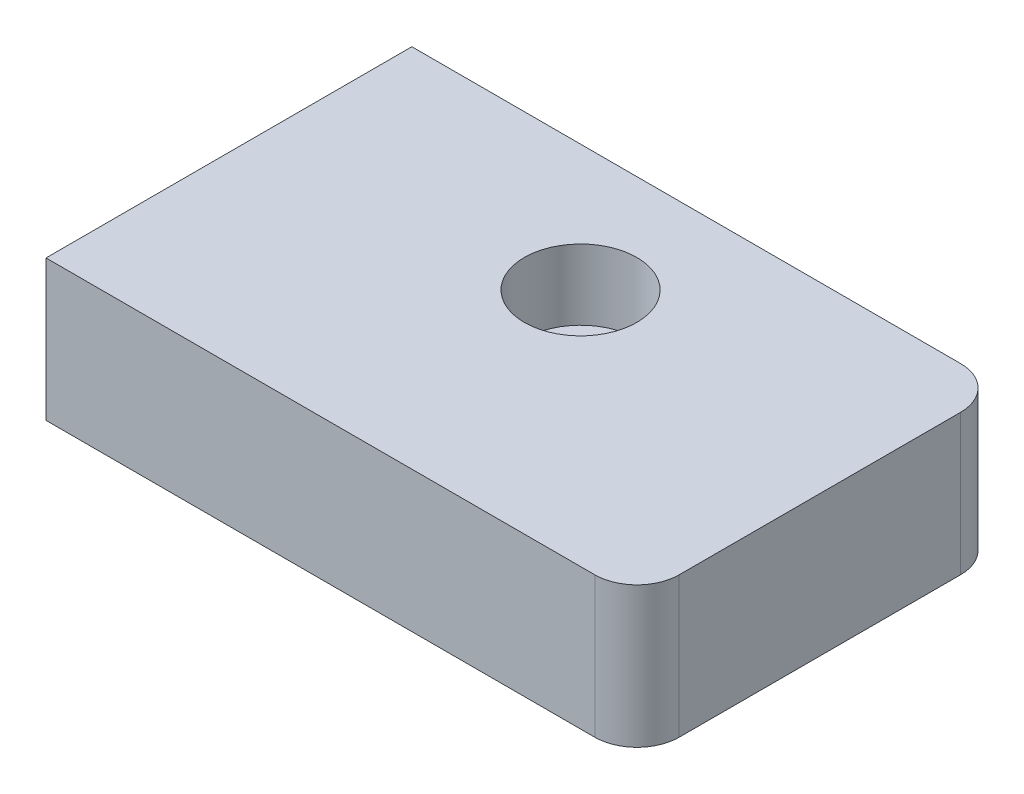
ISO-10303-21;
HEADER;
FILE_DESCRIPTION(('STEP AP214'),'2;1');
FILE_NAME('part.step','',(''),(''),'','','');
FILE_SCHEMA(('AUTOMOTIVE_DESIGN { 1 0 10303 214 1 1 1 1 }'));
ENDSEC;
DATA;
#1=APPLICATION_CONTEXT('core data for automotive mechanical design processes');
#2=APPLICATION_PROTOCOL_DEFINITION('international standard','automotive_design',2000,#1);
#3=PRODUCT_CONTEXT('',#1,'mechanical');
#4=PRODUCT('Part','Part','',(#3));
#5=PRODUCT_RELATED_PRODUCT_CATEGORY('part','',(#4));
#6=PRODUCT_DEFINITION_FORMATION('','',#4);
#7=PRODUCT_DEFINITION_CONTEXT('part definition',#1,'design');
#8=PRODUCT_DEFINITION('design','',#6,#7);
#9=PRODUCT_DEFINITION_SHAPE('','',#8);
#10=(LENGTH_UNIT() NAMED_UNIT(*) SI_UNIT(.MILLI.,.METRE.));
#11=(NAMED_UNIT(*) PLANE_ANGLE_UNIT() SI_UNIT($,.RADIAN.));
#12=(NAMED_UNIT(*) SI_UNIT($,.STERADIAN.) SOLID_ANGLE_UNIT());
#13=UNCERTAINTY_MEASURE_WITH_UNIT(LENGTH_MEASURE(1.E-05),#10,'distance_accuracy_value','');
#14=(GEOMETRIC_REPRESENTATION_CONTEXT(3) GLOBAL_UNCERTAINTY_ASSIGNED_CONTEXT((#13)) GLOBAL_UNIT_ASSIGNED_CONTEXT((#10,
#11,#12)) REPRESENTATION_CONTEXT('',''));
#15=CARTESIAN_POINT('',(0.,0.,0.));
#16=DIRECTION('',(0.,0.,1.));
#17=DIRECTION('',(1.,0.,0.));
#18=AXIS2_PLACEMENT_3D('',#15,#16,#17);
#19=CARTESIAN_POINT('',(21.,10.,-13.));
#20=DIRECTION('',(-1.,0.,0.));
#21=DIRECTION('',(0.,0.,1.));
#22=AXIS2_PLACEMENT_3D('',#19,#20,#21);
#23=PLANE('',#22);
#24=DIRECTION('',(0.,0.,-1.));
#25=VECTOR('',#24,1.);
#26=CARTESIAN_POINT('',(21.,0.,-13.));
#27=LINE('',#26,#25);
#28=CARTESIAN_POINT('',(21.,0.,9.99999999999999));
#29=VERTEX_POINT('',#28);
#30=CARTESIAN_POINT('',(21.,0.,-10.));
#31=VERTEX_POINT('',#30);
#32=EDGE_CURVE('E118',#29,#31,#27,.T.);
#33=ORIENTED_EDGE('',*,*,#32,.T.);
#34=DIRECTION('',(0.,-1.,0.));
#35=VECTOR('',#34,1.);
#36=CARTESIAN_POINT('',(21.,10.,-10.));
#37=LINE('',#36,#35);
#38=CARTESIAN_POINT('',(21.,10.,-10.));
#39=VERTEX_POINT('',#38);
#40=EDGE_CURVE('E56',#31,#39,#37,.F.);
#41=ORIENTED_EDGE('',*,*,#40,.T.);
#42=DIRECTION('',(0.,0.,-1.));
#43=VECTOR('',#42,1.);
#44=CARTESIAN_POINT('',(21.,10.,-13.));
#45=LINE('',#44,#43);
#46=CARTESIAN_POINT('',(21.,10.,9.99999999999999));
#47=VERTEX_POINT('',#46);
#48=EDGE_CURVE('E99',#47,#39,#45,.T.);
#49=ORIENTED_EDGE('',*,*,#48,.F.);
#50=DIRECTION('',(0.,-1.,0.));
#51=VECTOR('',#50,1.);
#52=CARTESIAN_POINT('',(21.,10.,10.));
#53=LINE('',#52,#51);
#54=EDGE_CURVE('E132',#47,#29,#53,.T.);
#55=ORIENTED_EDGE('',*,*,#54,.T.);
#56=EDGE_LOOP('',(#33,#41,#49,#55));
#57=FACE_BOUND('',#56,.T.);
#58=ADVANCED_FACE('F35',(#57),#23,.F.);
#59=CARTESIAN_POINT('',(-21.,10.,-13.));
#60=DIRECTION('',(0.,0.,1.));
#61=DIRECTION('',(1.,0.,0.));
#62=AXIS2_PLACEMENT_3D('',#59,#60,#61);
#63=PLANE('',#62);
#64=DIRECTION('',(-1.,0.,0.));
#65=VECTOR('',#64,1.);
#66=CARTESIAN_POINT('',(-21.,10.,-13.));
#67=LINE('',#66,#65);
#68=CARTESIAN_POINT('',(18.,10.,-13.));
#69=VERTEX_POINT('',#68);
#70=CARTESIAN_POINT('',(-21.,10.,-13.));
#71=VERTEX_POINT('',#70);
#72=EDGE_CURVE('E89',#69,#71,#67,.T.);
#73=ORIENTED_EDGE('',*,*,#72,.F.);
#74=DIRECTION('',(0.,-1.,0.));
#75=VECTOR('',#74,1.);
#76=CARTESIAN_POINT('',(18.,10.,-13.));
#77=LINE('',#76,#75);
#78=CARTESIAN_POINT('',(18.,0.,-13.));
#79=VERTEX_POINT('',#78);
#80=EDGE_CURVE('E108',#69,#79,#77,.T.);
#81=ORIENTED_EDGE('',*,*,#80,.T.);
#82=DIRECTION('',(-1.,0.,0.));
#83=VECTOR('',#82,1.);
#84=CARTESIAN_POINT('',(-21.,0.,-13.));
#85=LINE('',#84,#83);
#86=CARTESIAN_POINT('',(-21.,0.,-13.));
#87=VERTEX_POINT('',#86);
#88=EDGE_CURVE('E105',#79,#87,#85,.T.);
#89=ORIENTED_EDGE('',*,*,#88,.T.);
#90=DIRECTION('',(0.,-1.,0.));
#91=VECTOR('',#90,1.);
#92=CARTESIAN_POINT('',(-21.,10.,-13.));
#93=LINE('',#92,#91);
#94=EDGE_CURVE('E102',#71,#87,#93,.T.);
#95=ORIENTED_EDGE('',*,*,#94,.F.);
#96=EDGE_LOOP('',(#73,#81,#89,#95));
#97=FACE_BOUND('',#96,.T.);
#98=ADVANCED_FACE('F103',(#97),#63,.F.);
#99=CARTESIAN_POINT('',(-21.,10.,-13.));
#100=DIRECTION('',(1.,0.,0.));
#101=DIRECTION('',(0.,0.,-1.));
#102=AXIS2_PLACEMENT_3D('',#99,#100,#101);
#103=PLANE('',#102);
#104=DIRECTION('',(0.,0.,1.));
#105=VECTOR('',#104,1.);
#106=CARTESIAN_POINT('',(-21.,0.,-13.));
#107=LINE('',#106,#105);
#108=CARTESIAN_POINT('',(-21.,0.,13.));
#109=VERTEX_POINT('',#108);
#110=EDGE_CURVE('E122',#87,#109,#107,.T.);
#111=ORIENTED_EDGE('',*,*,#110,.T.);
#112=DIRECTION('',(0.,-1.,0.));
#113=VECTOR('',#112,1.);
#114=CARTESIAN_POINT('',(-21.,10.,13.));
#115=LINE('',#114,#113);
#116=CARTESIAN_POINT('',(-21.,10.,13.));
#117=VERTEX_POINT('',#116);
#118=EDGE_CURVE('E109',#117,#109,#115,.T.);
#119=ORIENTED_EDGE('',*,*,#118,.F.);
#120=DIRECTION('',(0.,0.,1.));
#121=VECTOR('',#120,1.);
#122=CARTESIAN_POINT('',(-21.,10.,-13.));
#123=LINE('',#122,#121);
#124=EDGE_CURVE('E93',#71,#117,#123,.T.);
#125=ORIENTED_EDGE('',*,*,#124,.F.);
#126=ORIENTED_EDGE('',*,*,#94,.T.);
#127=EDGE_LOOP('',(#111,#119,#125,#126));
#128=FACE_BOUND('',#127,.T.);
#129=ADVANCED_FACE('F111',(#128),#103,.F.);
#130=CARTESIAN_POINT('',(-21.,10.,13.));
#131=DIRECTION('',(0.,0.,-1.));
#132=DIRECTION('',(-1.,0.,0.));
#133=AXIS2_PLACEMENT_3D('',#130,#131,#132);
#134=PLANE('',#133);
#135=DIRECTION('',(1.,0.,0.));
#136=VECTOR('',#135,1.);
#137=CARTESIAN_POINT('',(-21.,0.,13.));
#138=LINE('',#137,#136);
#139=CARTESIAN_POINT('',(18.,0.,13.));
#140=VERTEX_POINT('',#139);
#141=EDGE_CURVE('E124',#109,#140,#138,.T.);
#142=ORIENTED_EDGE('',*,*,#141,.T.);
#143=DIRECTION('',(0.,-1.,0.));
#144=VECTOR('',#143,1.);
#145=CARTESIAN_POINT('',(18.,10.,13.));
#146=LINE('',#145,#144);
#147=CARTESIAN_POINT('',(18.,10.,13.));
#148=VERTEX_POINT('',#147);
#149=EDGE_CURVE('E11',#140,#148,#146,.F.);
#150=ORIENTED_EDGE('',*,*,#149,.T.);
#151=DIRECTION('',(1.,0.,0.));
#152=VECTOR('',#151,1.);
#153=CARTESIAN_POINT('',(-21.,10.,13.));
#154=LINE('',#153,#152);
#155=EDGE_CURVE('E113',#117,#148,#154,.T.);
#156=ORIENTED_EDGE('',*,*,#155,.F.);
#157=ORIENTED_EDGE('',*,*,#118,.T.);
#158=EDGE_LOOP('',(#142,#150,#156,#157));
#159=FACE_BOUND('',#158,.T.);
#160=ADVANCED_FACE('F144',(#159),#134,.F.);
#161=CARTESIAN_POINT('',(0.,10.,0.));
#162=DIRECTION('',(0.,1.,0.));
#163=DIRECTION('',(0.,0.,1.));
#164=AXIS2_PLACEMENT_3D('',#161,#162,#163);
#165=PLANE('',#164);
#166=CARTESIAN_POINT('',(-0.0355678371008056,10.,-4.02619460412027));
#167=DIRECTION('',(0.,1.,0.));
#168=DIRECTION('',(0.,0.,1.));
#169=AXIS2_PLACEMENT_3D('',#166,#167,#168);
#170=CIRCLE('',#169,4.);
#171=CARTESIAN_POINT('',(-0.0355678371008056,10.,-0.0261946041202679));
#172=VERTEX_POINT('',#171);
#173=EDGE_CURVE('E232',#172,#172,#170,.T.);
#174=ORIENTED_EDGE('',*,*,#173,.F.);
#175=EDGE_LOOP('',(#174));
#176=FACE_BOUND('',#175,.T.);
#177=ORIENTED_EDGE('',*,*,#48,.T.);
#178=CARTESIAN_POINT('',(18.,10.,-10.));
#179=DIRECTION('',(0.,1.,0.));
#180=DIRECTION('',(0.,0.,1.));
#181=AXIS2_PLACEMENT_3D('',#178,#179,#180);
#182=CIRCLE('',#181,3.);
#183=EDGE_CURVE('E43',#39,#69,#182,.T.);
#184=ORIENTED_EDGE('',*,*,#183,.T.);
#185=ORIENTED_EDGE('',*,*,#72,.T.);
#186=ORIENTED_EDGE('',*,*,#124,.T.);
#187=ORIENTED_EDGE('',*,*,#155,.T.);
#188=CARTESIAN_POINT('',(18.,10.,10.));
#189=DIRECTION('',(0.,1.,0.));
#190=DIRECTION('',(0.,0.,1.));
#191=AXIS2_PLACEMENT_3D('',#188,#189,#190);
#192=CIRCLE('',#191,3.);
#193=EDGE_CURVE('E136',#148,#47,#192,.T.);
#194=ORIENTED_EDGE('',*,*,#193,.T.);
#195=EDGE_LOOP('',(#177,#184,#185,#186,#187,#194));
#196=FACE_BOUND('',#195,.T.);
#197=ADVANCED_FACE('F91',(#176,#196),#165,.T.);
#198=CARTESIAN_POINT('',(0.,0.,0.));
#199=DIRECTION('',(0.,1.,0.));
#200=DIRECTION('',(0.,0.,1.));
#201=AXIS2_PLACEMENT_3D('',#198,#199,#200);
#202=PLANE('',#201);
#203=ORIENTED_EDGE('',*,*,#88,.F.);
#204=CARTESIAN_POINT('',(18.,0.,-10.));
#205=DIRECTION('',(0.,1.,0.));
#206=DIRECTION('',(0.,0.,1.));
#207=AXIS2_PLACEMENT_3D('',#204,#205,#206);
#208=CIRCLE('',#207,3.);
#209=EDGE_CURVE('E130',#79,#31,#208,.F.);
#210=ORIENTED_EDGE('',*,*,#209,.T.);
#211=ORIENTED_EDGE('',*,*,#32,.F.);
#212=CARTESIAN_POINT('',(18.,0.,10.));
#213=DIRECTION('',(0.,1.,0.));
#214=DIRECTION('',(0.,0.,1.));
#215=AXIS2_PLACEMENT_3D('',#212,#213,#214);
#216=CIRCLE('',#215,3.);
#217=EDGE_CURVE('E128',#29,#140,#216,.F.);
#218=ORIENTED_EDGE('',*,*,#217,.T.);
#219=ORIENTED_EDGE('',*,*,#141,.F.);
#220=ORIENTED_EDGE('',*,*,#110,.F.);
#221=EDGE_LOOP('',(#203,#210,#211,#218,#219,#220));
#222=FACE_BOUND('',#221,.T.);
#223=ADVANCED_FACE('F143',(#222),#202,.F.);
#224=CARTESIAN_POINT('',(-0.0355678371008056,5.,-4.02619460412027));
#225=DIRECTION('',(0.,1.,0.));
#226=DIRECTION('',(0.,0.,1.));
#227=AXIS2_PLACEMENT_3D('',#224,#225,#226);
#228=CYLINDRICAL_SURFACE('',#227,4.);
#229=CARTESIAN_POINT('',(-0.0355678371008056,5.,-4.02619460412027));
#230=DIRECTION('',(0.,1.,0.));
#231=DIRECTION('',(0.,0.,1.));
#232=AXIS2_PLACEMENT_3D('',#229,#230,#231);
#233=CIRCLE('',#232,4.);
#234=CARTESIAN_POINT('',(-0.0355678371008056,5.,-0.0261946041202679));
#235=VERTEX_POINT('',#234);
#236=EDGE_CURVE('E120',#235,#235,#233,.T.);
#237=ORIENTED_EDGE('',*,*,#236,.F.);
#238=EDGE_LOOP('',(#237));
#239=FACE_BOUND('',#238,.T.);
#240=ORIENTED_EDGE('',*,*,#173,.T.);
#241=EDGE_LOOP('',(#240));
#242=FACE_BOUND('',#241,.T.);
#243=ADVANCED_FACE('F170',(#239,#242),#228,.F.);
#244=CARTESIAN_POINT('',(-0.0355678371008056,5.,-4.02619460412027));
#245=DIRECTION('',(0.,1.,0.));
#246=DIRECTION('',(0.,0.,1.));
#247=AXIS2_PLACEMENT_3D('',#244,#245,#246);
#248=PLANE('',#247);
#249=ORIENTED_EDGE('',*,*,#236,.T.);
#250=EDGE_LOOP('',(#249));
#251=FACE_BOUND('',#250,.T.);
#252=ADVANCED_FACE('F164',(#251),#248,.T.);
#253=CARTESIAN_POINT('',(18.,10.,-10.));
#254=DIRECTION('',(0.,-1.,0.));
#255=DIRECTION('',(0.,0.,-1.));
#256=AXIS2_PLACEMENT_3D('',#253,#254,#255);
#257=CYLINDRICAL_SURFACE('',#256,3.);
#258=ORIENTED_EDGE('',*,*,#183,.F.);
#259=ORIENTED_EDGE('',*,*,#40,.F.);
#260=ORIENTED_EDGE('',*,*,#209,.F.);
#261=ORIENTED_EDGE('',*,*,#80,.F.);
#262=EDGE_LOOP('',(#258,#259,#260,#261));
#263=FACE_BOUND('',#262,.T.);
#264=ADVANCED_FACE('F162',(#263),#257,.T.);
#265=CARTESIAN_POINT('',(18.,10.,10.));
#266=DIRECTION('',(0.,-1.,0.));
#267=DIRECTION('',(0.,0.,-1.));
#268=AXIS2_PLACEMENT_3D('',#265,#266,#267);
#269=CYLINDRICAL_SURFACE('',#268,3.);
#270=ORIENTED_EDGE('',*,*,#193,.F.);
#271=ORIENTED_EDGE('',*,*,#149,.F.);
#272=ORIENTED_EDGE('',*,*,#217,.F.);
#273=ORIENTED_EDGE('',*,*,#54,.F.);
#274=EDGE_LOOP('',(#270,#271,#272,#273));
#275=FACE_BOUND('',#274,.T.);
#276=ADVANCED_FACE('F37',(#275),#269,.T.);
#277=CLOSED_SHELL('',(#58,#98,#129,#160,#197,#223,#243,#252,#264,#276));
#278=MANIFOLD_SOLID_BREP('B2',#277);
#279=ADVANCED_BREP_SHAPE_REPRESENTATION('',(#18,#278),#14);
#280=SHAPE_DEFINITION_REPRESENTATION(#9,#279);
ENDSEC;
END-ISO-10303-21;
